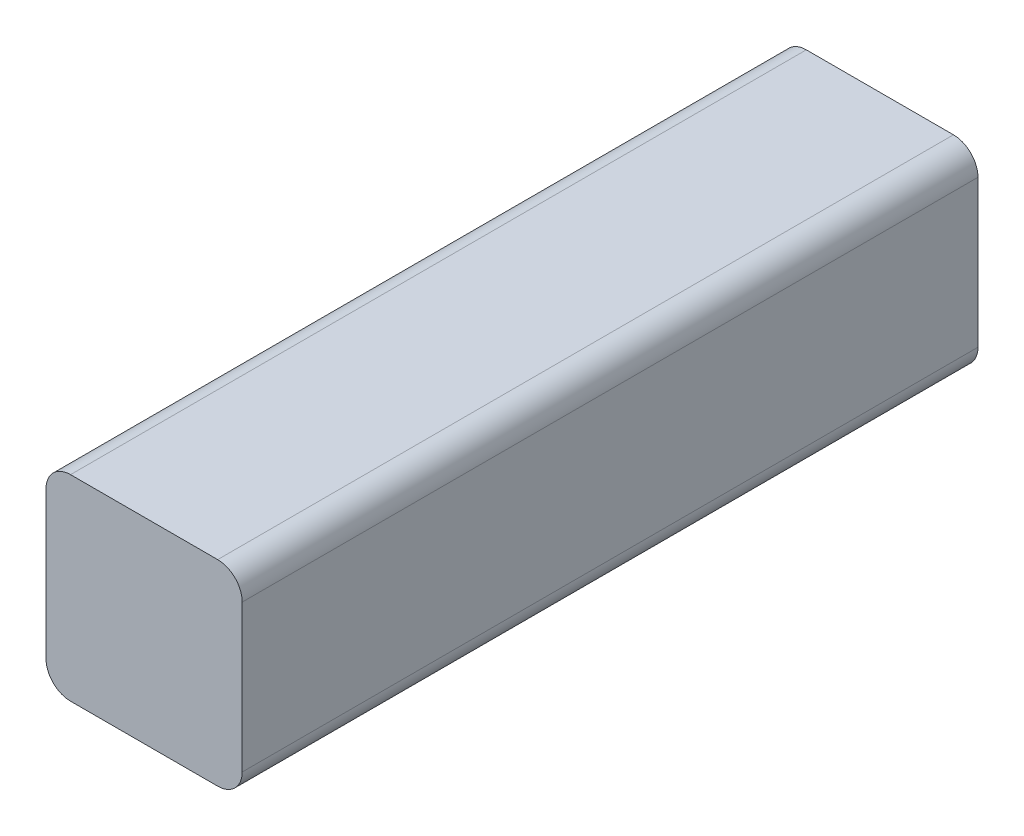
ISO-10303-21;
HEADER;
FILE_DESCRIPTION(('STEP AP214'),'2;1');
FILE_NAME('part.step','',(''),(''),'','','');
FILE_SCHEMA(('AUTOMOTIVE_DESIGN { 1 0 10303 214 1 1 1 1 }'));
ENDSEC;
DATA;
#1=APPLICATION_CONTEXT('core data for automotive mechanical design processes');
#2=APPLICATION_PROTOCOL_DEFINITION('international standard','automotive_design',2000,#1);
#3=PRODUCT_CONTEXT('',#1,'mechanical');
#4=PRODUCT('Part','Part','',(#3));
#5=PRODUCT_RELATED_PRODUCT_CATEGORY('part','',(#4));
#6=PRODUCT_DEFINITION_FORMATION('','',#4);
#7=PRODUCT_DEFINITION_CONTEXT('part definition',#1,'design');
#8=PRODUCT_DEFINITION('design','',#6,#7);
#9=PRODUCT_DEFINITION_SHAPE('','',#8);
#10=(LENGTH_UNIT() NAMED_UNIT(*) SI_UNIT(.MILLI.,.METRE.));
#11=(NAMED_UNIT(*) PLANE_ANGLE_UNIT() SI_UNIT($,.RADIAN.));
#12=(NAMED_UNIT(*) SI_UNIT($,.STERADIAN.) SOLID_ANGLE_UNIT());
#13=UNCERTAINTY_MEASURE_WITH_UNIT(LENGTH_MEASURE(1.E-05),#10,'distance_accuracy_value','');
#14=(GEOMETRIC_REPRESENTATION_CONTEXT(3) GLOBAL_UNCERTAINTY_ASSIGNED_CONTEXT((#13)) GLOBAL_UNIT_ASSIGNED_CONTEXT((#10,
#11,#12)) REPRESENTATION_CONTEXT('',''));
#15=CARTESIAN_POINT('',(0.,0.,0.));
#16=DIRECTION('',(0.,0.,1.));
#17=DIRECTION('',(1.,0.,0.));
#18=AXIS2_PLACEMENT_3D('',#15,#16,#17);
#19=CARTESIAN_POINT('',(20.,-63.,150.));
#20=DIRECTION('',(-1.,0.,0.));
#21=DIRECTION('',(0.,0.,1.));
#22=AXIS2_PLACEMENT_3D('',#19,#20,#21);
#23=PLANE('',#22);
#24=DIRECTION('',(0.,1.,0.));
#25=VECTOR('',#24,1.);
#26=CARTESIAN_POINT('',(20.,-63.,0.));
#27=LINE('',#26,#25);
#28=CARTESIAN_POINT('',(20.,-58.,0.));
#29=VERTEX_POINT('',#28);
#30=CARTESIAN_POINT('',(20.,-28.,0.));
#31=VERTEX_POINT('',#30);
#32=EDGE_CURVE('E128',#29,#31,#27,.T.);
#33=ORIENTED_EDGE('',*,*,#32,.T.);
#34=DIRECTION('',(0.,0.,-1.));
#35=VECTOR('',#34,1.);
#36=CARTESIAN_POINT('',(20.,-28.,150.));
#37=LINE('',#36,#35);
#38=CARTESIAN_POINT('',(20.,-28.,150.));
#39=VERTEX_POINT('',#38);
#40=EDGE_CURVE('E105',#31,#39,#37,.F.);
#41=ORIENTED_EDGE('',*,*,#40,.T.);
#42=DIRECTION('',(0.,1.,0.));
#43=VECTOR('',#42,1.);
#44=CARTESIAN_POINT('',(20.,-63.,150.));
#45=LINE('',#44,#43);
#46=CARTESIAN_POINT('',(20.,-58.,150.));
#47=VERTEX_POINT('',#46);
#48=EDGE_CURVE('E137',#47,#39,#45,.T.);
#49=ORIENTED_EDGE('',*,*,#48,.F.);
#50=DIRECTION('',(0.,0.,-1.));
#51=VECTOR('',#50,1.);
#52=CARTESIAN_POINT('',(20.,-58.,150.));
#53=LINE('',#52,#51);
#54=EDGE_CURVE('E110',#47,#29,#53,.T.);
#55=ORIENTED_EDGE('',*,*,#54,.T.);
#56=EDGE_LOOP('',(#33,#41,#49,#55));
#57=FACE_BOUND('',#56,.T.);
#58=ADVANCED_FACE('F33',(#57),#23,.F.);
#59=CARTESIAN_POINT('',(20.,-23.,150.));
#60=DIRECTION('',(0.,-1.,0.));
#61=DIRECTION('',(1.,0.,0.));
#62=AXIS2_PLACEMENT_3D('',#59,#60,#61);
#63=PLANE('',#62);
#64=DIRECTION('',(-1.,0.,0.));
#65=VECTOR('',#64,1.);
#66=CARTESIAN_POINT('',(20.,-23.,150.));
#67=LINE('',#66,#65);
#68=CARTESIAN_POINT('',(15.,-23.,150.));
#69=VERTEX_POINT('',#68);
#70=CARTESIAN_POINT('',(-15.,-23.,150.));
#71=VERTEX_POINT('',#70);
#72=EDGE_CURVE('E120',#69,#71,#67,.T.);
#73=ORIENTED_EDGE('',*,*,#72,.F.);
#74=DIRECTION('',(0.,0.,-1.));
#75=VECTOR('',#74,1.);
#76=CARTESIAN_POINT('',(15.,-23.,150.));
#77=LINE('',#76,#75);
#78=CARTESIAN_POINT('',(15.,-23.,0.));
#79=VERTEX_POINT('',#78);
#80=EDGE_CURVE('E104',#69,#79,#77,.T.);
#81=ORIENTED_EDGE('',*,*,#80,.T.);
#82=DIRECTION('',(-1.,0.,0.));
#83=VECTOR('',#82,1.);
#84=CARTESIAN_POINT('',(20.,-23.,0.));
#85=LINE('',#84,#83);
#86=CARTESIAN_POINT('',(-15.,-23.,0.));
#87=VERTEX_POINT('',#86);
#88=EDGE_CURVE('E117',#79,#87,#85,.T.);
#89=ORIENTED_EDGE('',*,*,#88,.T.);
#90=DIRECTION('',(0.,0.,-1.));
#91=VECTOR('',#90,1.);
#92=CARTESIAN_POINT('',(-15.,-23.,150.));
#93=LINE('',#92,#91);
#94=EDGE_CURVE('E122',#87,#71,#93,.F.);
#95=ORIENTED_EDGE('',*,*,#94,.T.);
#96=EDGE_LOOP('',(#73,#81,#89,#95));
#97=FACE_BOUND('',#96,.T.);
#98=ADVANCED_FACE('F116',(#97),#63,.F.);
#99=CARTESIAN_POINT('',(-20.,-63.,150.));
#100=DIRECTION('',(1.,0.,0.));
#101=DIRECTION('',(0.,0.,-1.));
#102=AXIS2_PLACEMENT_3D('',#99,#100,#101);
#103=PLANE('',#102);
#104=DIRECTION('',(0.,-1.,0.));
#105=VECTOR('',#104,1.);
#106=CARTESIAN_POINT('',(-20.,-63.,150.));
#107=LINE('',#106,#105);
#108=CARTESIAN_POINT('',(-20.,-28.,150.));
#109=VERTEX_POINT('',#108);
#110=CARTESIAN_POINT('',(-20.,-58.,150.));
#111=VERTEX_POINT('',#110);
#112=EDGE_CURVE('E160',#109,#111,#107,.T.);
#113=ORIENTED_EDGE('',*,*,#112,.F.);
#114=DIRECTION('',(0.,0.,-1.));
#115=VECTOR('',#114,1.);
#116=CARTESIAN_POINT('',(-20.,-28.,150.));
#117=LINE('',#116,#115);
#118=CARTESIAN_POINT('',(-20.,-28.,0.));
#119=VERTEX_POINT('',#118);
#120=EDGE_CURVE('E11',#109,#119,#117,.T.);
#121=ORIENTED_EDGE('',*,*,#120,.T.);
#122=DIRECTION('',(0.,-1.,0.));
#123=VECTOR('',#122,1.);
#124=CARTESIAN_POINT('',(-20.,-63.,0.));
#125=LINE('',#124,#123);
#126=CARTESIAN_POINT('',(-20.,-58.,0.));
#127=VERTEX_POINT('',#126);
#128=EDGE_CURVE('E127',#119,#127,#125,.T.);
#129=ORIENTED_EDGE('',*,*,#128,.T.);
#130=DIRECTION('',(0.,0.,-1.));
#131=VECTOR('',#130,1.);
#132=CARTESIAN_POINT('',(-20.,-58.,150.));
#133=LINE('',#132,#131);
#134=EDGE_CURVE('E41',#127,#111,#133,.F.);
#135=ORIENTED_EDGE('',*,*,#134,.T.);
#136=EDGE_LOOP('',(#113,#121,#129,#135));
#137=FACE_BOUND('',#136,.T.);
#138=ADVANCED_FACE('F159',(#137),#103,.F.);
#139=CARTESIAN_POINT('',(20.,-63.,150.));
#140=DIRECTION('',(0.,1.,0.));
#141=DIRECTION('',(-1.,0.,0.));
#142=AXIS2_PLACEMENT_3D('',#139,#140,#141);
#143=PLANE('',#142);
#144=DIRECTION('',(1.,0.,0.));
#145=VECTOR('',#144,1.);
#146=CARTESIAN_POINT('',(20.,-63.,0.));
#147=LINE('',#146,#145);
#148=CARTESIAN_POINT('',(-15.,-63.,0.));
#149=VERTEX_POINT('',#148);
#150=CARTESIAN_POINT('',(15.,-63.,0.));
#151=VERTEX_POINT('',#150);
#152=EDGE_CURVE('E131',#149,#151,#147,.T.);
#153=ORIENTED_EDGE('',*,*,#152,.T.);
#154=DIRECTION('',(0.,0.,-1.));
#155=VECTOR('',#154,1.);
#156=CARTESIAN_POINT('',(15.,-63.,150.));
#157=LINE('',#156,#155);
#158=CARTESIAN_POINT('',(15.,-63.,150.));
#159=VERTEX_POINT('',#158);
#160=EDGE_CURVE('E48',#151,#159,#157,.F.);
#161=ORIENTED_EDGE('',*,*,#160,.T.);
#162=DIRECTION('',(1.,0.,0.));
#163=VECTOR('',#162,1.);
#164=CARTESIAN_POINT('',(20.,-63.,150.));
#165=LINE('',#164,#163);
#166=CARTESIAN_POINT('',(-15.,-63.,150.));
#167=VERTEX_POINT('',#166);
#168=EDGE_CURVE('E138',#167,#159,#165,.T.);
#169=ORIENTED_EDGE('',*,*,#168,.F.);
#170=DIRECTION('',(0.,0.,-1.));
#171=VECTOR('',#170,1.);
#172=CARTESIAN_POINT('',(-15.,-63.,150.));
#173=LINE('',#172,#171);
#174=EDGE_CURVE('E153',#167,#149,#173,.T.);
#175=ORIENTED_EDGE('',*,*,#174,.T.);
#176=EDGE_LOOP('',(#153,#161,#169,#175));
#177=FACE_BOUND('',#176,.T.);
#178=ADVANCED_FACE('F169',(#177),#143,.F.);
#179=CARTESIAN_POINT('',(0.,0.,150.));
#180=DIRECTION('',(0.,0.,1.));
#181=DIRECTION('',(1.,0.,0.));
#182=AXIS2_PLACEMENT_3D('',#179,#180,#181);
#183=PLANE('',#182);
#184=ORIENTED_EDGE('',*,*,#48,.T.);
#185=CARTESIAN_POINT('',(15.,-28.,150.));
#186=DIRECTION('',(0.,0.,1.));
#187=DIRECTION('',(1.,0.,0.));
#188=AXIS2_PLACEMENT_3D('',#185,#186,#187);
#189=CIRCLE('',#188,5.);
#190=EDGE_CURVE('E151',#39,#69,#189,.T.);
#191=ORIENTED_EDGE('',*,*,#190,.T.);
#192=ORIENTED_EDGE('',*,*,#72,.T.);
#193=CARTESIAN_POINT('',(-15.,-28.,150.));
#194=DIRECTION('',(0.,0.,1.));
#195=DIRECTION('',(1.,0.,0.));
#196=AXIS2_PLACEMENT_3D('',#193,#194,#195);
#197=CIRCLE('',#196,5.);
#198=EDGE_CURVE('E147',#71,#109,#197,.T.);
#199=ORIENTED_EDGE('',*,*,#198,.T.);
#200=ORIENTED_EDGE('',*,*,#112,.T.);
#201=CARTESIAN_POINT('',(-15.,-58.,150.));
#202=DIRECTION('',(0.,0.,1.));
#203=DIRECTION('',(1.,0.,0.));
#204=AXIS2_PLACEMENT_3D('',#201,#202,#203);
#205=CIRCLE('',#204,5.);
#206=EDGE_CURVE('E55',#111,#167,#205,.T.);
#207=ORIENTED_EDGE('',*,*,#206,.T.);
#208=ORIENTED_EDGE('',*,*,#168,.T.);
#209=CARTESIAN_POINT('',(15.,-58.,150.));
#210=DIRECTION('',(0.,0.,1.));
#211=DIRECTION('',(1.,0.,0.));
#212=AXIS2_PLACEMENT_3D('',#209,#210,#211);
#213=CIRCLE('',#212,5.);
#214=EDGE_CURVE('E149',#159,#47,#213,.T.);
#215=ORIENTED_EDGE('',*,*,#214,.T.);
#216=EDGE_LOOP('',(#184,#191,#192,#199,#200,#207,#208,#215));
#217=FACE_BOUND('',#216,.T.);
#218=ADVANCED_FACE('F164',(#217),#183,.T.);
#219=CARTESIAN_POINT('',(0.,0.,0.));
#220=DIRECTION('',(0.,0.,1.));
#221=DIRECTION('',(1.,0.,0.));
#222=AXIS2_PLACEMENT_3D('',#219,#220,#221);
#223=PLANE('',#222);
#224=ORIENTED_EDGE('',*,*,#88,.F.);
#225=CARTESIAN_POINT('',(15.,-28.,0.));
#226=DIRECTION('',(0.,0.,1.));
#227=DIRECTION('',(1.,0.,0.));
#228=AXIS2_PLACEMENT_3D('',#225,#226,#227);
#229=CIRCLE('',#228,5.);
#230=EDGE_CURVE('E100',#79,#31,#229,.F.);
#231=ORIENTED_EDGE('',*,*,#230,.T.);
#232=ORIENTED_EDGE('',*,*,#32,.F.);
#233=CARTESIAN_POINT('',(15.,-58.,0.));
#234=DIRECTION('',(0.,0.,1.));
#235=DIRECTION('',(1.,0.,0.));
#236=AXIS2_PLACEMENT_3D('',#233,#234,#235);
#237=CIRCLE('',#236,5.);
#238=EDGE_CURVE('E111',#29,#151,#237,.F.);
#239=ORIENTED_EDGE('',*,*,#238,.T.);
#240=ORIENTED_EDGE('',*,*,#152,.F.);
#241=CARTESIAN_POINT('',(-15.,-58.,0.));
#242=DIRECTION('',(0.,0.,1.));
#243=DIRECTION('',(1.,0.,0.));
#244=AXIS2_PLACEMENT_3D('',#241,#242,#243);
#245=CIRCLE('',#244,5.);
#246=EDGE_CURVE('E121',#149,#127,#245,.F.);
#247=ORIENTED_EDGE('',*,*,#246,.T.);
#248=ORIENTED_EDGE('',*,*,#128,.F.);
#249=CARTESIAN_POINT('',(-15.,-28.,0.));
#250=DIRECTION('',(0.,0.,1.));
#251=DIRECTION('',(1.,0.,0.));
#252=AXIS2_PLACEMENT_3D('',#249,#250,#251);
#253=CIRCLE('',#252,5.);
#254=EDGE_CURVE('E126',#119,#87,#253,.F.);
#255=ORIENTED_EDGE('',*,*,#254,.T.);
#256=EDGE_LOOP('',(#224,#231,#232,#239,#240,#247,#248,#255));
#257=FACE_BOUND('',#256,.T.);
#258=ADVANCED_FACE('F124',(#257),#223,.F.);
#259=CARTESIAN_POINT('',(15.,-28.,150.));
#260=DIRECTION('',(0.,0.,-1.));
#261=DIRECTION('',(-1.,0.,0.));
#262=AXIS2_PLACEMENT_3D('',#259,#260,#261);
#263=CYLINDRICAL_SURFACE('',#262,5.);
#264=ORIENTED_EDGE('',*,*,#190,.F.);
#265=ORIENTED_EDGE('',*,*,#40,.F.);
#266=ORIENTED_EDGE('',*,*,#230,.F.);
#267=ORIENTED_EDGE('',*,*,#80,.F.);
#268=EDGE_LOOP('',(#264,#265,#266,#267));
#269=FACE_BOUND('',#268,.T.);
#270=ADVANCED_FACE('F103',(#269),#263,.T.);
#271=CARTESIAN_POINT('',(15.,-58.,150.));
#272=DIRECTION('',(0.,0.,-1.));
#273=DIRECTION('',(-1.,0.,0.));
#274=AXIS2_PLACEMENT_3D('',#271,#272,#273);
#275=CYLINDRICAL_SURFACE('',#274,5.);
#276=ORIENTED_EDGE('',*,*,#214,.F.);
#277=ORIENTED_EDGE('',*,*,#160,.F.);
#278=ORIENTED_EDGE('',*,*,#238,.F.);
#279=ORIENTED_EDGE('',*,*,#54,.F.);
#280=EDGE_LOOP('',(#276,#277,#278,#279));
#281=FACE_BOUND('',#280,.T.);
#282=ADVANCED_FACE('F173',(#281),#275,.T.);
#283=CARTESIAN_POINT('',(-15.,-28.,150.));
#284=DIRECTION('',(0.,0.,-1.));
#285=DIRECTION('',(-1.,0.,0.));
#286=AXIS2_PLACEMENT_3D('',#283,#284,#285);
#287=CYLINDRICAL_SURFACE('',#286,5.);
#288=ORIENTED_EDGE('',*,*,#198,.F.);
#289=ORIENTED_EDGE('',*,*,#94,.F.);
#290=ORIENTED_EDGE('',*,*,#254,.F.);
#291=ORIENTED_EDGE('',*,*,#120,.F.);
#292=EDGE_LOOP('',(#288,#289,#290,#291));
#293=FACE_BOUND('',#292,.T.);
#294=ADVANCED_FACE('F179',(#293),#287,.T.);
#295=CARTESIAN_POINT('',(-15.,-58.,150.));
#296=DIRECTION('',(0.,0.,-1.));
#297=DIRECTION('',(-1.,0.,0.));
#298=AXIS2_PLACEMENT_3D('',#295,#296,#297);
#299=CYLINDRICAL_SURFACE('',#298,5.);
#300=ORIENTED_EDGE('',*,*,#206,.F.);
#301=ORIENTED_EDGE('',*,*,#134,.F.);
#302=ORIENTED_EDGE('',*,*,#246,.F.);
#303=ORIENTED_EDGE('',*,*,#174,.F.);
#304=EDGE_LOOP('',(#300,#301,#302,#303));
#305=FACE_BOUND('',#304,.T.);
#306=ADVANCED_FACE('F35',(#305),#299,.T.);
#307=CLOSED_SHELL('',(#58,#98,#138,#178,#218,#258,#270,#282,#294,#306));
#308=MANIFOLD_SOLID_BREP('B2',#307);
#309=ADVANCED_BREP_SHAPE_REPRESENTATION('',(#18,#308),#14);
#310=SHAPE_DEFINITION_REPRESENTATION(#9,#309);
ENDSEC;
END-ISO-10303-21;
